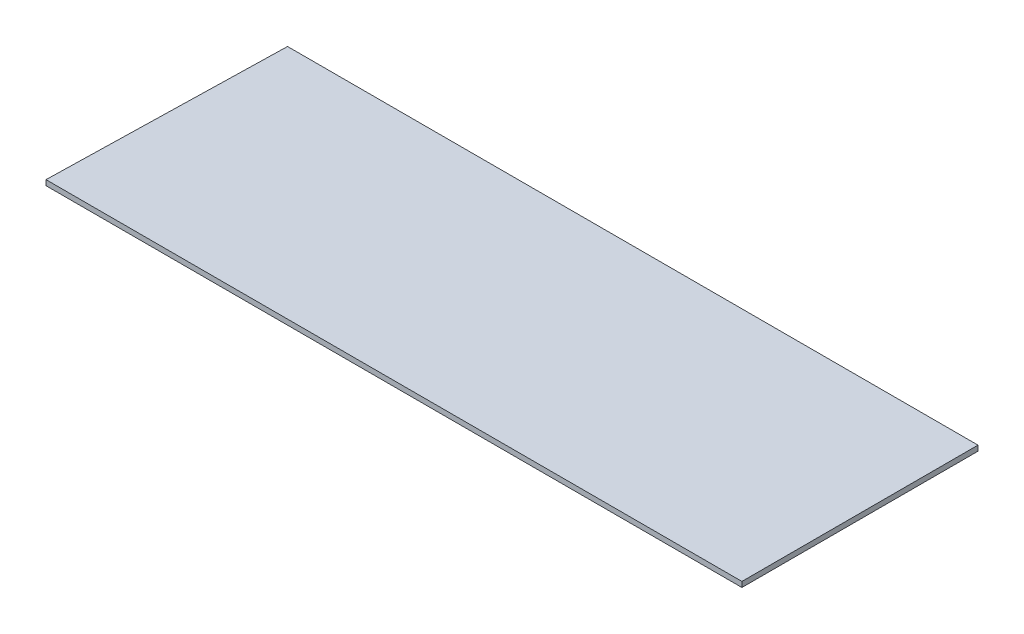
ISO-10303-21;
HEADER;
FILE_DESCRIPTION(('STEP AP214'),'2;1');
FILE_NAME('part.step','',(''),(''),'','','');
FILE_SCHEMA(('AUTOMOTIVE_DESIGN { 1 0 10303 214 1 1 1 1 }'));
ENDSEC;
DATA;
#1=APPLICATION_CONTEXT('core data for automotive mechanical design processes');
#2=APPLICATION_PROTOCOL_DEFINITION('international standard','automotive_design',2000,#1);
#3=PRODUCT_CONTEXT('',#1,'mechanical');
#4=PRODUCT('Part','Part','',(#3));
#5=PRODUCT_RELATED_PRODUCT_CATEGORY('part','',(#4));
#6=PRODUCT_DEFINITION_FORMATION('','',#4);
#7=PRODUCT_DEFINITION_CONTEXT('part definition',#1,'design');
#8=PRODUCT_DEFINITION('design','',#6,#7);
#9=PRODUCT_DEFINITION_SHAPE('','',#8);
#10=(LENGTH_UNIT() NAMED_UNIT(*) SI_UNIT(.MILLI.,.METRE.));
#11=(NAMED_UNIT(*) PLANE_ANGLE_UNIT() SI_UNIT($,.RADIAN.));
#12=(NAMED_UNIT(*) SI_UNIT($,.STERADIAN.) SOLID_ANGLE_UNIT());
#13=UNCERTAINTY_MEASURE_WITH_UNIT(LENGTH_MEASURE(1.E-05),#10,'distance_accuracy_value','');
#14=(GEOMETRIC_REPRESENTATION_CONTEXT(3) GLOBAL_UNCERTAINTY_ASSIGNED_CONTEXT((#13)) GLOBAL_UNIT_ASSIGNED_CONTEXT((#10,
#11,#12)) REPRESENTATION_CONTEXT('',''));
#15=CARTESIAN_POINT('',(0.,0.,0.));
#16=DIRECTION('',(0.,0.,1.));
#17=DIRECTION('',(1.,0.,0.));
#18=AXIS2_PLACEMENT_3D('',#15,#16,#17);
#19=CARTESIAN_POINT('',(79.4678114387325,-0.01,-117.327188940092));
#20=DIRECTION('',(-0.999731860443843,0.,-0.0231561485029853));
#21=DIRECTION('',(-0.0231561485029853,0.,0.999731860443843));
#22=AXIS2_PLACEMENT_3D('',#19,#20,#21);
#23=PLANE('',#22);
#24=DIRECTION('',(0.,-1.,0.));
#25=VECTOR('',#24,1.);
#26=CARTESIAN_POINT('',(79.4678114387324,3.,-117.327188940092));
#27=LINE('',#26,#25);
#28=CARTESIAN_POINT('',(79.4678114387325,3.,-117.327188940092));
#29=VERTEX_POINT('',#28);
#30=CARTESIAN_POINT('',(79.4678114387325,0.,-117.327188940092));
#31=VERTEX_POINT('',#30);
#32=EDGE_CURVE('E80',#29,#31,#27,.T.);
#33=ORIENTED_EDGE('',*,*,#32,.T.);
#34=DIRECTION('',(-0.0231561485029853,0.,0.999731860443843));
#35=VECTOR('',#34,1.);
#36=CARTESIAN_POINT('',(76.7090829082938,0.,1.77676333588454));
#37=LINE('',#36,#35);
#38=CARTESIAN_POINT('',(76.3640552995388,0.,16.6728110599078));
#39=VERTEX_POINT('',#38);
#40=EDGE_CURVE('E88',#31,#39,#37,.T.);
#41=ORIENTED_EDGE('',*,*,#40,.T.);
#42=DIRECTION('',(0.,1.,0.));
#43=VECTOR('',#42,1.);
#44=CARTESIAN_POINT('',(76.3640552995388,3.,16.6728110599078));
#45=LINE('',#44,#43);
#46=CARTESIAN_POINT('',(76.3640552995388,3.,16.6728110599078));
#47=VERTEX_POINT('',#46);
#48=EDGE_CURVE('E89',#39,#47,#45,.T.);
#49=ORIENTED_EDGE('',*,*,#48,.T.);
#50=DIRECTION('',(-0.0231561485029853,0.,0.999731860443843));
#51=VECTOR('',#50,1.);
#52=CARTESIAN_POINT('',(76.7090829082938,3.,1.77676333588454));
#53=LINE('',#52,#51);
#54=EDGE_CURVE('E64',#29,#47,#53,.T.);
#55=ORIENTED_EDGE('',*,*,#54,.F.);
#56=EDGE_LOOP('',(#33,#41,#49,#55));
#57=FACE_BOUND('',#56,.T.);
#58=ADVANCED_FACE('F32',(#57),#23,.T.);
#59=CARTESIAN_POINT('',(-318.635944700461,3.,16.6728110599078));
#60=DIRECTION('',(0.,0.,-1.));
#61=DIRECTION('',(-1.,0.,0.));
#62=AXIS2_PLACEMENT_3D('',#59,#60,#61);
#63=PLANE('',#62);
#64=ORIENTED_EDGE('',*,*,#48,.F.);
#65=DIRECTION('',(1.,0.,0.));
#66=VECTOR('',#65,1.);
#67=CARTESIAN_POINT('',(-318.635944700461,0.,16.6728110599078));
#68=LINE('',#67,#66);
#69=CARTESIAN_POINT('',(471.364055299539,0.,16.6728110599078));
#70=VERTEX_POINT('',#69);
#71=EDGE_CURVE('E11',#39,#70,#68,.T.);
#72=ORIENTED_EDGE('',*,*,#71,.T.);
#73=DIRECTION('',(0.,-1.,0.));
#74=VECTOR('',#73,1.);
#75=CARTESIAN_POINT('',(471.364055299539,3.,16.6728110599078));
#76=LINE('',#75,#74);
#77=CARTESIAN_POINT('',(471.364055299539,3.,16.6728110599078));
#78=VERTEX_POINT('',#77);
#79=EDGE_CURVE('E102',#78,#70,#76,.T.);
#80=ORIENTED_EDGE('',*,*,#79,.F.);
#81=DIRECTION('',(1.,0.,0.));
#82=VECTOR('',#81,1.);
#83=CARTESIAN_POINT('',(-318.635944700461,3.,16.6728110599078));
#84=LINE('',#83,#82);
#85=EDGE_CURVE('E85',#47,#78,#84,.T.);
#86=ORIENTED_EDGE('',*,*,#85,.F.);
#87=EDGE_LOOP('',(#64,#72,#80,#86));
#88=FACE_BOUND('',#87,.T.);
#89=ADVANCED_FACE('F103',(#88),#63,.F.);
#90=CARTESIAN_POINT('',(471.364055299539,3.,-117.327188940092));
#91=DIRECTION('',(-1.,0.,0.));
#92=DIRECTION('',(0.,0.,1.));
#93=AXIS2_PLACEMENT_3D('',#90,#91,#92);
#94=PLANE('',#93);
#95=DIRECTION('',(0.,0.,-1.));
#96=VECTOR('',#95,1.);
#97=CARTESIAN_POINT('',(471.364055299539,0.,-117.327188940092));
#98=LINE('',#97,#96);
#99=CARTESIAN_POINT('',(471.364055299539,0.,-117.327188940092));
#100=VERTEX_POINT('',#99);
#101=EDGE_CURVE('E41',#70,#100,#98,.T.);
#102=ORIENTED_EDGE('',*,*,#101,.T.);
#103=DIRECTION('',(0.,-1.,0.));
#104=VECTOR('',#103,1.);
#105=CARTESIAN_POINT('',(471.364055299539,3.,-117.327188940092));
#106=LINE('',#105,#104);
#107=CARTESIAN_POINT('',(471.364055299539,3.,-117.327188940092));
#108=VERTEX_POINT('',#107);
#109=EDGE_CURVE('E81',#108,#100,#106,.T.);
#110=ORIENTED_EDGE('',*,*,#109,.F.);
#111=DIRECTION('',(0.,0.,-1.));
#112=VECTOR('',#111,1.);
#113=CARTESIAN_POINT('',(471.364055299539,3.,-117.327188940092));
#114=LINE('',#113,#112);
#115=EDGE_CURVE('E59',#78,#108,#114,.T.);
#116=ORIENTED_EDGE('',*,*,#115,.F.);
#117=ORIENTED_EDGE('',*,*,#79,.T.);
#118=EDGE_LOOP('',(#102,#110,#116,#117));
#119=FACE_BOUND('',#118,.T.);
#120=ADVANCED_FACE('F106',(#119),#94,.F.);
#121=CARTESIAN_POINT('',(-318.635944700461,3.,-117.327188940092));
#122=DIRECTION('',(0.,0.,1.));
#123=DIRECTION('',(1.,0.,0.));
#124=AXIS2_PLACEMENT_3D('',#121,#122,#123);
#125=PLANE('',#124);
#126=ORIENTED_EDGE('',*,*,#32,.F.);
#127=DIRECTION('',(-1.,0.,0.));
#128=VECTOR('',#127,1.);
#129=CARTESIAN_POINT('',(-318.635944700461,3.,-117.327188940092));
#130=LINE('',#129,#128);
#131=EDGE_CURVE('E95',#108,#29,#130,.T.);
#132=ORIENTED_EDGE('',*,*,#131,.F.);
#133=ORIENTED_EDGE('',*,*,#109,.T.);
#134=DIRECTION('',(-1.,0.,0.));
#135=VECTOR('',#134,1.);
#136=CARTESIAN_POINT('',(-318.635944700461,0.,-117.327188940092));
#137=LINE('',#136,#135);
#138=EDGE_CURVE('E76',#100,#31,#137,.T.);
#139=ORIENTED_EDGE('',*,*,#138,.T.);
#140=EDGE_LOOP('',(#126,#132,#133,#139));
#141=FACE_BOUND('',#140,.T.);
#142=ADVANCED_FACE('F78',(#141),#125,.F.);
#143=CARTESIAN_POINT('',(0.,0.,0.));
#144=DIRECTION('',(0.,1.,0.));
#145=DIRECTION('',(0.,0.,1.));
#146=AXIS2_PLACEMENT_3D('',#143,#144,#145);
#147=PLANE('',#146);
#148=ORIENTED_EDGE('',*,*,#40,.F.);
#149=ORIENTED_EDGE('',*,*,#138,.F.);
#150=ORIENTED_EDGE('',*,*,#101,.F.);
#151=ORIENTED_EDGE('',*,*,#71,.F.);
#152=EDGE_LOOP('',(#148,#149,#150,#151));
#153=FACE_BOUND('',#152,.T.);
#154=ADVANCED_FACE('F91',(#153),#147,.F.);
#155=CARTESIAN_POINT('',(0.,3.,0.));
#156=DIRECTION('',(0.,1.,0.));
#157=DIRECTION('',(0.,0.,1.));
#158=AXIS2_PLACEMENT_3D('',#155,#156,#157);
#159=PLANE('',#158);
#160=ORIENTED_EDGE('',*,*,#131,.T.);
#161=ORIENTED_EDGE('',*,*,#54,.T.);
#162=ORIENTED_EDGE('',*,*,#85,.T.);
#163=ORIENTED_EDGE('',*,*,#115,.T.);
#164=EDGE_LOOP('',(#160,#161,#162,#163));
#165=FACE_BOUND('',#164,.T.);
#166=ADVANCED_FACE('F34',(#165),#159,.T.);
#167=CLOSED_SHELL('',(#58,#89,#120,#142,#154,#166));
#168=MANIFOLD_SOLID_BREP('B2',#167);
#169=ADVANCED_BREP_SHAPE_REPRESENTATION('',(#18,#168),#14);
#170=SHAPE_DEFINITION_REPRESENTATION(#9,#169);
ENDSEC;
END-ISO-10303-21;
